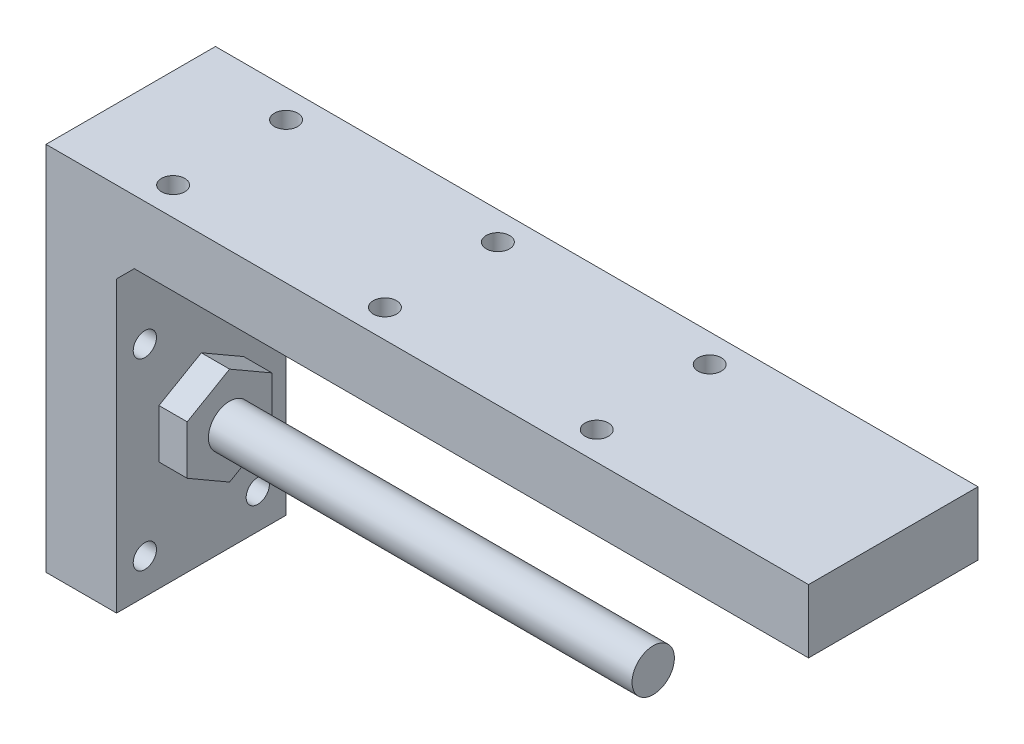
ISO-10303-21;
HEADER;
FILE_DESCRIPTION(('STEP AP214'),'2;1');
FILE_NAME('part.step','',(''),(''),'','','');
FILE_SCHEMA(('AUTOMOTIVE_DESIGN { 1 0 10303 214 1 1 1 1 }'));
ENDSEC;
DATA;
#1=APPLICATION_CONTEXT('core data for automotive mechanical design processes');
#2=APPLICATION_PROTOCOL_DEFINITION('international standard','automotive_design',2000,#1);
#3=PRODUCT_CONTEXT('',#1,'mechanical');
#4=PRODUCT('Part','Part','',(#3));
#5=PRODUCT_RELATED_PRODUCT_CATEGORY('part','',(#4));
#6=PRODUCT_DEFINITION_FORMATION('','',#4);
#7=PRODUCT_DEFINITION_CONTEXT('part definition',#1,'design');
#8=PRODUCT_DEFINITION('design','',#6,#7);
#9=PRODUCT_DEFINITION_SHAPE('','',#8);
#10=(LENGTH_UNIT() NAMED_UNIT(*) SI_UNIT(.MILLI.,.METRE.));
#11=(NAMED_UNIT(*) PLANE_ANGLE_UNIT() SI_UNIT($,.RADIAN.));
#12=(NAMED_UNIT(*) SI_UNIT($,.STERADIAN.) SOLID_ANGLE_UNIT());
#13=UNCERTAINTY_MEASURE_WITH_UNIT(LENGTH_MEASURE(1.E-05),#10,'distance_accuracy_value','');
#14=(GEOMETRIC_REPRESENTATION_CONTEXT(3) GLOBAL_UNCERTAINTY_ASSIGNED_CONTEXT((#13)) GLOBAL_UNIT_ASSIGNED_CONTEXT((#10,
#11,#12)) REPRESENTATION_CONTEXT('',''));
#15=CARTESIAN_POINT('',(0.,0.,0.));
#16=DIRECTION('',(0.,0.,1.));
#17=DIRECTION('',(1.,0.,0.));
#18=AXIS2_PLACEMENT_3D('',#15,#16,#17);
#19=CARTESIAN_POINT('',(9.99999999999999,43.5,24.));
#20=DIRECTION('',(-1.,0.,0.));
#21=DIRECTION('',(0.,-1.,0.));
#22=AXIS2_PLACEMENT_3D('',#19,#20,#21);
#23=PLANE('',#22);
#24=CARTESIAN_POINT('',(10.,31.,4.));
#25=DIRECTION('',(-1.,0.,0.));
#26=DIRECTION('',(0.,-1.,0.));
#27=AXIS2_PLACEMENT_3D('',#24,#25,#26);
#28=CIRCLE('',#27,1.64999999999999);
#29=CARTESIAN_POINT('',(10.,29.35,4.));
#30=VERTEX_POINT('',#29);
#31=EDGE_CURVE('E416',#30,#30,#28,.T.);
#32=ORIENTED_EDGE('',*,*,#31,.T.);
#33=EDGE_LOOP('',(#32));
#34=FACE_BOUND('',#33,.T.);
#35=CARTESIAN_POINT('',(10.,31.,20.));
#36=DIRECTION('',(-1.,0.,0.));
#37=DIRECTION('',(0.,-1.,0.));
#38=AXIS2_PLACEMENT_3D('',#35,#36,#37);
#39=CIRCLE('',#38,1.64999999999999);
#40=CARTESIAN_POINT('',(10.,29.35,20.));
#41=VERTEX_POINT('',#40);
#42=EDGE_CURVE('E408',#41,#41,#39,.T.);
#43=ORIENTED_EDGE('',*,*,#42,.T.);
#44=EDGE_LOOP('',(#43));
#45=FACE_BOUND('',#44,.T.);
#46=CARTESIAN_POINT('',(10.,5.,20.));
#47=DIRECTION('',(-1.,0.,0.));
#48=DIRECTION('',(0.,-1.,0.));
#49=AXIS2_PLACEMENT_3D('',#46,#47,#48);
#50=CIRCLE('',#49,1.64999999999999);
#51=CARTESIAN_POINT('',(10.,3.35000000000001,20.));
#52=VERTEX_POINT('',#51);
#53=EDGE_CURVE('E400',#52,#52,#50,.T.);
#54=ORIENTED_EDGE('',*,*,#53,.T.);
#55=EDGE_LOOP('',(#54));
#56=FACE_BOUND('',#55,.T.);
#57=CARTESIAN_POINT('',(10.,5.,4.));
#58=DIRECTION('',(-1.,0.,0.));
#59=DIRECTION('',(0.,-1.,0.));
#60=AXIS2_PLACEMENT_3D('',#57,#58,#59);
#61=CIRCLE('',#60,1.64999999999999);
#62=CARTESIAN_POINT('',(10.,3.35000000000001,4.));
#63=VERTEX_POINT('',#62);
#64=EDGE_CURVE('E392',#63,#63,#61,.T.);
#65=ORIENTED_EDGE('',*,*,#64,.T.);
#66=EDGE_LOOP('',(#65));
#67=FACE_BOUND('',#66,.T.);
#68=DIRECTION('',(0.,1.,0.));
#69=VECTOR('',#68,1.);
#70=CARTESIAN_POINT('',(9.99999999999999,43.5,0.));
#71=LINE('',#70,#69);
#72=CARTESIAN_POINT('',(10.,0.,0.));
#73=VERTEX_POINT('',#72);
#74=CARTESIAN_POINT('',(9.99999999999999,41.,0.));
#75=VERTEX_POINT('',#74);
#76=EDGE_CURVE('E300',#73,#75,#71,.T.);
#77=ORIENTED_EDGE('',*,*,#76,.T.);
#78=DIRECTION('',(0.,0.,1.));
#79=VECTOR('',#78,1.);
#80=CARTESIAN_POINT('',(9.99999999999999,41.,24.));
#81=LINE('',#80,#79);
#82=CARTESIAN_POINT('',(9.99999999999999,41.,24.));
#83=VERTEX_POINT('',#82);
#84=EDGE_CURVE('E186',#75,#83,#81,.T.);
#85=ORIENTED_EDGE('',*,*,#84,.T.);
#86=DIRECTION('',(0.,1.,0.));
#87=VECTOR('',#86,1.);
#88=CARTESIAN_POINT('',(9.99999999999999,43.5,24.));
#89=LINE('',#88,#87);
#90=CARTESIAN_POINT('',(10.,0.,24.));
#91=VERTEX_POINT('',#90);
#92=EDGE_CURVE('E280',#91,#83,#89,.T.);
#93=ORIENTED_EDGE('',*,*,#92,.F.);
#94=DIRECTION('',(0.,0.,-1.));
#95=VECTOR('',#94,1.);
#96=CARTESIAN_POINT('',(10.,0.,24.));
#97=LINE('',#96,#95);
#98=EDGE_CURVE('E175',#91,#73,#97,.T.);
#99=ORIENTED_EDGE('',*,*,#98,.T.);
#100=EDGE_LOOP('',(#77,#85,#93,#99));
#101=FACE_BOUND('',#100,.T.);
#102=DIRECTION('',(0.,1.,0.));
#103=VECTOR('',#102,1.);
#104=CARTESIAN_POINT('',(10.,15.5358983848622,6.));
#105=LINE('',#104,#103);
#106=CARTESIAN_POINT('',(10.,15.5358983848622,6.));
#107=VERTEX_POINT('',#106);
#108=CARTESIAN_POINT('',(10.,22.4641016151378,6.));
#109=VERTEX_POINT('',#108);
#110=EDGE_CURVE('E229',#107,#109,#105,.T.);
#111=ORIENTED_EDGE('',*,*,#110,.F.);
#112=DIRECTION('',(0.,0.5,-0.866025403784439));
#113=VECTOR('',#112,1.);
#114=CARTESIAN_POINT('',(10.,12.0717967697245,12.));
#115=LINE('',#114,#113);
#116=CARTESIAN_POINT('',(10.,12.0717967697245,12.));
#117=VERTEX_POINT('',#116);
#118=EDGE_CURVE('E213',#117,#107,#115,.T.);
#119=ORIENTED_EDGE('',*,*,#118,.F.);
#120=DIRECTION('',(0.,-0.5,-0.866025403784439));
#121=VECTOR('',#120,1.);
#122=CARTESIAN_POINT('',(10.,15.5358983848622,18.));
#123=LINE('',#122,#121);
#124=CARTESIAN_POINT('',(10.,15.5358983848622,18.));
#125=VERTEX_POINT('',#124);
#126=EDGE_CURVE('E245',#125,#117,#123,.T.);
#127=ORIENTED_EDGE('',*,*,#126,.F.);
#128=DIRECTION('',(0.,-1.,0.));
#129=VECTOR('',#128,1.);
#130=CARTESIAN_POINT('',(10.,22.4641016151378,18.));
#131=LINE('',#130,#129);
#132=CARTESIAN_POINT('',(10.,22.4641016151378,18.));
#133=VERTEX_POINT('',#132);
#134=EDGE_CURVE('E241',#133,#125,#131,.T.);
#135=ORIENTED_EDGE('',*,*,#134,.F.);
#136=DIRECTION('',(0.,-0.5,0.866025403784438));
#137=VECTOR('',#136,1.);
#138=CARTESIAN_POINT('',(10.,25.9282032302755,12.));
#139=LINE('',#138,#137);
#140=CARTESIAN_POINT('',(10.,25.9282032302755,12.));
#141=VERTEX_POINT('',#140);
#142=EDGE_CURVE('E237',#141,#133,#139,.T.);
#143=ORIENTED_EDGE('',*,*,#142,.F.);
#144=DIRECTION('',(0.,0.5,0.866025403784439));
#145=VECTOR('',#144,1.);
#146=CARTESIAN_POINT('',(10.,22.4641016151378,6.));
#147=LINE('',#146,#145);
#148=EDGE_CURVE('E233',#109,#141,#147,.T.);
#149=ORIENTED_EDGE('',*,*,#148,.F.);
#150=EDGE_LOOP('',(#111,#119,#127,#135,#143,#149));
#151=FACE_BOUND('',#150,.T.);
#152=ADVANCED_FACE('F49',(#34,#45,#56,#67,#101,#151),#23,.F.);
#153=CARTESIAN_POINT('',(10.,0.,24.));
#154=DIRECTION('',(0.,1.,0.));
#155=DIRECTION('',(-1.,0.,0.));
#156=AXIS2_PLACEMENT_3D('',#153,#154,#155);
#157=PLANE('',#156);
#158=DIRECTION('',(1.,0.,0.));
#159=VECTOR('',#158,1.);
#160=CARTESIAN_POINT('',(10.,0.,0.));
#161=LINE('',#160,#159);
#162=CARTESIAN_POINT('',(0.,0.,0.));
#163=VERTEX_POINT('',#162);
#164=EDGE_CURVE('E275',#163,#73,#161,.T.);
#165=ORIENTED_EDGE('',*,*,#164,.T.);
#166=ORIENTED_EDGE('',*,*,#98,.F.);
#167=DIRECTION('',(1.,0.,0.));
#168=VECTOR('',#167,1.);
#169=CARTESIAN_POINT('',(10.,0.,24.));
#170=LINE('',#169,#168);
#171=CARTESIAN_POINT('',(0.,0.,24.));
#172=VERTEX_POINT('',#171);
#173=EDGE_CURVE('E276',#172,#91,#170,.T.);
#174=ORIENTED_EDGE('',*,*,#173,.F.);
#175=DIRECTION('',(0.,0.,-1.));
#176=VECTOR('',#175,1.);
#177=CARTESIAN_POINT('',(0.,0.,24.));
#178=LINE('',#177,#176);
#179=EDGE_CURVE('E296',#172,#163,#178,.T.);
#180=ORIENTED_EDGE('',*,*,#179,.T.);
#181=EDGE_LOOP('',(#165,#166,#174,#180));
#182=FACE_BOUND('',#181,.T.);
#183=ADVANCED_FACE('F445',(#182),#157,.F.);
#184=CARTESIAN_POINT('',(108.,43.5,24.));
#185=DIRECTION('',(0.,1.,0.));
#186=DIRECTION('',(-1.,0.,0.));
#187=AXIS2_PLACEMENT_3D('',#184,#185,#186);
#188=PLANE('',#187);
#189=CARTESIAN_POINT('',(44.,43.5,4.));
#190=DIRECTION('',(0.,1.,0.));
#191=DIRECTION('',(-1.,0.,0.));
#192=AXIS2_PLACEMENT_3D('',#189,#190,#191);
#193=CIRCLE('',#192,1.65);
#194=CARTESIAN_POINT('',(42.35,43.5,4.));
#195=VERTEX_POINT('',#194);
#196=EDGE_CURVE('E382',#195,#195,#193,.T.);
#197=ORIENTED_EDGE('',*,*,#196,.T.);
#198=EDGE_LOOP('',(#197));
#199=FACE_BOUND('',#198,.T.);
#200=CARTESIAN_POINT('',(74.,43.5,3.99999999999999));
#201=DIRECTION('',(0.,1.,0.));
#202=DIRECTION('',(-1.,0.,0.));
#203=AXIS2_PLACEMENT_3D('',#200,#201,#202);
#204=CIRCLE('',#203,1.65);
#205=CARTESIAN_POINT('',(72.35,43.5,3.99999999999999));
#206=VERTEX_POINT('',#205);
#207=EDGE_CURVE('E374',#206,#206,#204,.T.);
#208=ORIENTED_EDGE('',*,*,#207,.T.);
#209=EDGE_LOOP('',(#208));
#210=FACE_BOUND('',#209,.T.);
#211=CARTESIAN_POINT('',(74.,43.5,20.));
#212=DIRECTION('',(0.,1.,0.));
#213=DIRECTION('',(-1.,0.,0.));
#214=AXIS2_PLACEMENT_3D('',#211,#212,#213);
#215=CIRCLE('',#214,1.65);
#216=CARTESIAN_POINT('',(72.35,43.5,20.));
#217=VERTEX_POINT('',#216);
#218=EDGE_CURVE('E366',#217,#217,#215,.T.);
#219=ORIENTED_EDGE('',*,*,#218,.T.);
#220=EDGE_LOOP('',(#219));
#221=FACE_BOUND('',#220,.T.);
#222=CARTESIAN_POINT('',(44.,43.5,20.));
#223=DIRECTION('',(0.,1.,0.));
#224=DIRECTION('',(-1.,0.,0.));
#225=AXIS2_PLACEMENT_3D('',#222,#223,#224);
#226=CIRCLE('',#225,1.65);
#227=CARTESIAN_POINT('',(42.35,43.5,20.));
#228=VERTEX_POINT('',#227);
#229=EDGE_CURVE('E356',#228,#228,#226,.T.);
#230=ORIENTED_EDGE('',*,*,#229,.T.);
#231=EDGE_LOOP('',(#230));
#232=FACE_BOUND('',#231,.T.);
#233=DIRECTION('',(0.,0.,-1.));
#234=VECTOR('',#233,1.);
#235=CARTESIAN_POINT('',(12.5,43.5,0.));
#236=LINE('',#235,#234);
#237=CARTESIAN_POINT('',(12.5,43.5,19.3126136457566));
#238=VERTEX_POINT('',#237);
#239=CARTESIAN_POINT('',(12.5,43.5,4.68738635424337));
#240=VERTEX_POINT('',#239);
#241=EDGE_CURVE('E167',#238,#240,#236,.T.);
#242=ORIENTED_EDGE('',*,*,#241,.T.);
#243=CARTESIAN_POINT('',(14.,43.5,4.));
#244=DIRECTION('',(0.,1.,0.));
#245=DIRECTION('',(-1.,0.,0.));
#246=AXIS2_PLACEMENT_3D('',#243,#244,#245);
#247=CIRCLE('',#246,1.65);
#248=CARTESIAN_POINT('',(12.5,43.5,3.31261364575663));
#249=VERTEX_POINT('',#248);
#250=EDGE_CURVE('E65',#240,#249,#247,.T.);
#251=ORIENTED_EDGE('',*,*,#250,.T.);
#252=CARTESIAN_POINT('',(12.5,43.5,0.));
#253=VERTEX_POINT('',#252);
#254=EDGE_CURVE('E165',#249,#253,#236,.T.);
#255=ORIENTED_EDGE('',*,*,#254,.T.);
#256=DIRECTION('',(1.,0.,0.));
#257=VECTOR('',#256,1.);
#258=CARTESIAN_POINT('',(108.,43.5,0.));
#259=LINE('',#258,#257);
#260=CARTESIAN_POINT('',(108.,43.5,0.));
#261=VERTEX_POINT('',#260);
#262=EDGE_CURVE('E303',#253,#261,#259,.T.);
#263=ORIENTED_EDGE('',*,*,#262,.T.);
#264=DIRECTION('',(0.,0.,-1.));
#265=VECTOR('',#264,1.);
#266=CARTESIAN_POINT('',(108.,43.5,24.));
#267=LINE('',#266,#265);
#268=CARTESIAN_POINT('',(108.,43.5,24.));
#269=VERTEX_POINT('',#268);
#270=EDGE_CURVE('E181',#269,#261,#267,.T.);
#271=ORIENTED_EDGE('',*,*,#270,.F.);
#272=DIRECTION('',(1.,0.,0.));
#273=VECTOR('',#272,1.);
#274=CARTESIAN_POINT('',(108.,43.5,24.));
#275=LINE('',#274,#273);
#276=CARTESIAN_POINT('',(12.5,43.5,24.));
#277=VERTEX_POINT('',#276);
#278=EDGE_CURVE('E284',#277,#269,#275,.T.);
#279=ORIENTED_EDGE('',*,*,#278,.F.);
#280=CARTESIAN_POINT('',(12.5,43.5,20.6873863542434));
#281=VERTEX_POINT('',#280);
#282=EDGE_CURVE('E177',#277,#281,#236,.T.);
#283=ORIENTED_EDGE('',*,*,#282,.T.);
#284=CARTESIAN_POINT('',(14.,43.5,20.));
#285=DIRECTION('',(0.,1.,0.));
#286=DIRECTION('',(-1.,0.,0.));
#287=AXIS2_PLACEMENT_3D('',#284,#285,#286);
#288=CIRCLE('',#287,1.65);
#289=EDGE_CURVE('E72',#281,#238,#288,.T.);
#290=ORIENTED_EDGE('',*,*,#289,.T.);
#291=EDGE_LOOP('',(#242,#251,#255,#263,#271,#279,#283,#290));
#292=FACE_BOUND('',#291,.T.);
#293=ADVANCED_FACE('F164',(#199,#210,#221,#232,#292),#188,.F.);
#294=CARTESIAN_POINT('',(108.,52.5,24.));
#295=DIRECTION('',(-1.,0.,0.));
#296=DIRECTION('',(0.,-1.,0.));
#297=AXIS2_PLACEMENT_3D('',#294,#295,#296);
#298=PLANE('',#297);
#299=DIRECTION('',(0.,1.,0.));
#300=VECTOR('',#299,1.);
#301=CARTESIAN_POINT('',(108.,52.5,0.));
#302=LINE('',#301,#300);
#303=CARTESIAN_POINT('',(108.,52.5,0.));
#304=VERTEX_POINT('',#303);
#305=EDGE_CURVE('E306',#261,#304,#302,.T.);
#306=ORIENTED_EDGE('',*,*,#305,.T.);
#307=DIRECTION('',(0.,0.,-1.));
#308=VECTOR('',#307,1.);
#309=CARTESIAN_POINT('',(108.,52.5,24.));
#310=LINE('',#309,#308);
#311=CARTESIAN_POINT('',(108.,52.5,24.));
#312=VERTEX_POINT('',#311);
#313=EDGE_CURVE('E321',#312,#304,#310,.T.);
#314=ORIENTED_EDGE('',*,*,#313,.F.);
#315=DIRECTION('',(0.,1.,0.));
#316=VECTOR('',#315,1.);
#317=CARTESIAN_POINT('',(108.,52.5,24.));
#318=LINE('',#317,#316);
#319=EDGE_CURVE('E287',#269,#312,#318,.T.);
#320=ORIENTED_EDGE('',*,*,#319,.F.);
#321=ORIENTED_EDGE('',*,*,#270,.T.);
#322=EDGE_LOOP('',(#306,#314,#320,#321));
#323=FACE_BOUND('',#322,.T.);
#324=ADVANCED_FACE('F331',(#323),#298,.F.);
#325=CARTESIAN_POINT('',(0.,52.5,24.));
#326=DIRECTION('',(0.,-1.,0.));
#327=DIRECTION('',(0.,0.,-1.));
#328=AXIS2_PLACEMENT_3D('',#325,#326,#327);
#329=PLANE('',#328);
#330=CARTESIAN_POINT('',(14.,52.5,4.));
#331=DIRECTION('',(0.,1.,0.));
#332=DIRECTION('',(0.,0.,1.));
#333=AXIS2_PLACEMENT_3D('',#330,#331,#332);
#334=CIRCLE('',#333,1.65);
#335=CARTESIAN_POINT('',(14.,52.5,5.65));
#336=VERTEX_POINT('',#335);
#337=EDGE_CURVE('E161',#336,#336,#334,.T.);
#338=ORIENTED_EDGE('',*,*,#337,.F.);
#339=EDGE_LOOP('',(#338));
#340=FACE_BOUND('',#339,.T.);
#341=CARTESIAN_POINT('',(44.,52.5,4.));
#342=DIRECTION('',(0.,1.,0.));
#343=DIRECTION('',(0.,0.,1.));
#344=AXIS2_PLACEMENT_3D('',#341,#342,#343);
#345=CIRCLE('',#344,1.65);
#346=CARTESIAN_POINT('',(44.,52.5,5.64999999999999));
#347=VERTEX_POINT('',#346);
#348=EDGE_CURVE('E169',#347,#347,#345,.T.);
#349=ORIENTED_EDGE('',*,*,#348,.F.);
#350=EDGE_LOOP('',(#349));
#351=FACE_BOUND('',#350,.T.);
#352=CARTESIAN_POINT('',(74.,52.5,3.99999999999999));
#353=DIRECTION('',(0.,1.,0.));
#354=DIRECTION('',(0.,0.,1.));
#355=AXIS2_PLACEMENT_3D('',#352,#353,#354);
#356=CIRCLE('',#355,1.65);
#357=CARTESIAN_POINT('',(74.,52.5,5.64999999999999));
#358=VERTEX_POINT('',#357);
#359=EDGE_CURVE('E378',#358,#358,#356,.T.);
#360=ORIENTED_EDGE('',*,*,#359,.F.);
#361=EDGE_LOOP('',(#360));
#362=FACE_BOUND('',#361,.T.);
#363=CARTESIAN_POINT('',(74.,52.5,20.));
#364=DIRECTION('',(0.,1.,0.));
#365=DIRECTION('',(0.,0.,1.));
#366=AXIS2_PLACEMENT_3D('',#363,#364,#365);
#367=CIRCLE('',#366,1.65);
#368=CARTESIAN_POINT('',(74.,52.5,21.65));
#369=VERTEX_POINT('',#368);
#370=EDGE_CURVE('E370',#369,#369,#367,.T.);
#371=ORIENTED_EDGE('',*,*,#370,.F.);
#372=EDGE_LOOP('',(#371));
#373=FACE_BOUND('',#372,.T.);
#374=CARTESIAN_POINT('',(44.,52.5,20.));
#375=DIRECTION('',(0.,1.,0.));
#376=DIRECTION('',(0.,0.,1.));
#377=AXIS2_PLACEMENT_3D('',#374,#375,#376);
#378=CIRCLE('',#377,1.65);
#379=CARTESIAN_POINT('',(44.,52.5,21.65));
#380=VERTEX_POINT('',#379);
#381=EDGE_CURVE('E362',#380,#380,#378,.T.);
#382=ORIENTED_EDGE('',*,*,#381,.F.);
#383=EDGE_LOOP('',(#382));
#384=FACE_BOUND('',#383,.T.);
#385=CARTESIAN_POINT('',(14.,52.5,20.));
#386=DIRECTION('',(0.,1.,0.));
#387=DIRECTION('',(0.,0.,1.));
#388=AXIS2_PLACEMENT_3D('',#385,#386,#387);
#389=CIRCLE('',#388,1.65);
#390=CARTESIAN_POINT('',(14.,52.5,21.65));
#391=VERTEX_POINT('',#390);
#392=EDGE_CURVE('E351',#391,#391,#389,.T.);
#393=ORIENTED_EDGE('',*,*,#392,.F.);
#394=EDGE_LOOP('',(#393));
#395=FACE_BOUND('',#394,.T.);
#396=DIRECTION('',(-1.,0.,0.));
#397=VECTOR('',#396,1.);
#398=CARTESIAN_POINT('',(0.,52.5,0.));
#399=LINE('',#398,#397);
#400=CARTESIAN_POINT('',(0.,52.5,0.));
#401=VERTEX_POINT('',#400);
#402=EDGE_CURVE('E309',#304,#401,#399,.T.);
#403=ORIENTED_EDGE('',*,*,#402,.T.);
#404=DIRECTION('',(0.,0.,-1.));
#405=VECTOR('',#404,1.);
#406=CARTESIAN_POINT('',(0.,52.5,24.));
#407=LINE('',#406,#405);
#408=CARTESIAN_POINT('',(0.,52.5,24.));
#409=VERTEX_POINT('',#408);
#410=EDGE_CURVE('E317',#409,#401,#407,.T.);
#411=ORIENTED_EDGE('',*,*,#410,.F.);
#412=DIRECTION('',(-1.,0.,0.));
#413=VECTOR('',#412,1.);
#414=CARTESIAN_POINT('',(0.,52.5,24.));
#415=LINE('',#414,#413);
#416=EDGE_CURVE('E290',#312,#409,#415,.T.);
#417=ORIENTED_EDGE('',*,*,#416,.F.);
#418=ORIENTED_EDGE('',*,*,#313,.T.);
#419=EDGE_LOOP('',(#403,#411,#417,#418));
#420=FACE_BOUND('',#419,.T.);
#421=ADVANCED_FACE('F340',(#340,#351,#362,#373,#384,#395,#420),#329,.F.);
#422=CARTESIAN_POINT('',(0.,0.,24.));
#423=DIRECTION('',(1.,0.,0.));
#424=DIRECTION('',(0.,0.,-1.));
#425=AXIS2_PLACEMENT_3D('',#422,#423,#424);
#426=PLANE('',#425);
#427=CARTESIAN_POINT('',(0.,31.,4.));
#428=DIRECTION('',(-1.,0.,0.));
#429=DIRECTION('',(0.,0.,1.));
#430=AXIS2_PLACEMENT_3D('',#427,#428,#429);
#431=CIRCLE('',#430,1.64999999999999);
#432=CARTESIAN_POINT('',(0.,31.,5.64999999999999));
#433=VERTEX_POINT('',#432);
#434=EDGE_CURVE('E420',#433,#433,#431,.T.);
#435=ORIENTED_EDGE('',*,*,#434,.F.);
#436=EDGE_LOOP('',(#435));
#437=FACE_BOUND('',#436,.T.);
#438=CARTESIAN_POINT('',(0.,31.,20.));
#439=DIRECTION('',(-1.,0.,0.));
#440=DIRECTION('',(0.,0.,1.));
#441=AXIS2_PLACEMENT_3D('',#438,#439,#440);
#442=CIRCLE('',#441,1.64999999999999);
#443=CARTESIAN_POINT('',(0.,31.,21.65));
#444=VERTEX_POINT('',#443);
#445=EDGE_CURVE('E412',#444,#444,#442,.T.);
#446=ORIENTED_EDGE('',*,*,#445,.F.);
#447=EDGE_LOOP('',(#446));
#448=FACE_BOUND('',#447,.T.);
#449=CARTESIAN_POINT('',(0.,5.,20.));
#450=DIRECTION('',(-1.,0.,0.));
#451=DIRECTION('',(0.,0.,1.));
#452=AXIS2_PLACEMENT_3D('',#449,#450,#451);
#453=CIRCLE('',#452,1.64999999999999);
#454=CARTESIAN_POINT('',(0.,5.,21.65));
#455=VERTEX_POINT('',#454);
#456=EDGE_CURVE('E404',#455,#455,#453,.T.);
#457=ORIENTED_EDGE('',*,*,#456,.F.);
#458=EDGE_LOOP('',(#457));
#459=FACE_BOUND('',#458,.T.);
#460=CARTESIAN_POINT('',(0.,5.,4.));
#461=DIRECTION('',(-1.,0.,0.));
#462=DIRECTION('',(0.,0.,1.));
#463=AXIS2_PLACEMENT_3D('',#460,#461,#462);
#464=CIRCLE('',#463,1.64999999999999);
#465=CARTESIAN_POINT('',(0.,5.,5.64999999999999));
#466=VERTEX_POINT('',#465);
#467=EDGE_CURVE('E396',#466,#466,#464,.T.);
#468=ORIENTED_EDGE('',*,*,#467,.F.);
#469=EDGE_LOOP('',(#468));
#470=FACE_BOUND('',#469,.T.);
#471=DIRECTION('',(0.,-1.,0.));
#472=VECTOR('',#471,1.);
#473=CARTESIAN_POINT('',(0.,0.,0.));
#474=LINE('',#473,#472);
#475=EDGE_CURVE('E281',#401,#163,#474,.T.);
#476=ORIENTED_EDGE('',*,*,#475,.T.);
#477=ORIENTED_EDGE('',*,*,#179,.F.);
#478=DIRECTION('',(0.,-1.,0.));
#479=VECTOR('',#478,1.);
#480=CARTESIAN_POINT('',(0.,0.,24.));
#481=LINE('',#480,#479);
#482=EDGE_CURVE('E293',#409,#172,#481,.T.);
#483=ORIENTED_EDGE('',*,*,#482,.F.);
#484=ORIENTED_EDGE('',*,*,#410,.T.);
#485=EDGE_LOOP('',(#476,#477,#483,#484));
#486=FACE_BOUND('',#485,.T.);
#487=ADVANCED_FACE('F344',(#437,#448,#459,#470,#486),#426,.F.);
#488=CARTESIAN_POINT('',(0.,0.,24.));
#489=DIRECTION('',(0.,0.,-1.));
#490=DIRECTION('',(-1.,0.,0.));
#491=AXIS2_PLACEMENT_3D('',#488,#489,#490);
#492=PLANE('',#491);
#493=ORIENTED_EDGE('',*,*,#173,.T.);
#494=ORIENTED_EDGE('',*,*,#92,.T.);
#495=DIRECTION('',(-0.707106781186549,-0.707106781186546,0.));
#496=VECTOR('',#495,1.);
#497=CARTESIAN_POINT('',(-15.5,15.5000000000001,24.));
#498=LINE('',#497,#496);
#499=EDGE_CURVE('E194',#83,#277,#498,.F.);
#500=ORIENTED_EDGE('',*,*,#499,.T.);
#501=ORIENTED_EDGE('',*,*,#278,.T.);
#502=ORIENTED_EDGE('',*,*,#319,.T.);
#503=ORIENTED_EDGE('',*,*,#416,.T.);
#504=ORIENTED_EDGE('',*,*,#482,.T.);
#505=EDGE_LOOP('',(#493,#494,#500,#501,#502,#503,#504));
#506=FACE_BOUND('',#505,.T.);
#507=ADVANCED_FACE('F347',(#506),#492,.F.);
#508=CARTESIAN_POINT('',(0.,0.,0.));
#509=DIRECTION('',(0.,0.,-1.));
#510=DIRECTION('',(-1.,0.,0.));
#511=AXIS2_PLACEMENT_3D('',#508,#509,#510);
#512=PLANE('',#511);
#513=ORIENTED_EDGE('',*,*,#164,.F.);
#514=ORIENTED_EDGE('',*,*,#475,.F.);
#515=ORIENTED_EDGE('',*,*,#402,.F.);
#516=ORIENTED_EDGE('',*,*,#305,.F.);
#517=ORIENTED_EDGE('',*,*,#262,.F.);
#518=DIRECTION('',(0.707106781186549,0.707106781186546,0.));
#519=VECTOR('',#518,1.);
#520=CARTESIAN_POINT('',(12.5,43.5,0.));
#521=LINE('',#520,#519);
#522=EDGE_CURVE('E172',#253,#75,#521,.F.);
#523=ORIENTED_EDGE('',*,*,#522,.T.);
#524=ORIENTED_EDGE('',*,*,#76,.F.);
#525=EDGE_LOOP('',(#513,#514,#515,#516,#517,#523,#524));
#526=FACE_BOUND('',#525,.T.);
#527=ADVANCED_FACE('F336',(#526),#512,.T.);
#528=CARTESIAN_POINT('',(12.5,43.5,24.));
#529=DIRECTION('',(0.707106781186546,-0.707106781186549,0.));
#530=DIRECTION('',(0.,0.,1.));
#531=AXIS2_PLACEMENT_3D('',#528,#529,#530);
#532=PLANE('',#531);
#533=ORIENTED_EDGE('',*,*,#254,.F.);
#534=CARTESIAN_POINT('',(14.,45.,4.));
#535=DIRECTION('',(0.707106781186546,-0.707106781186549,0.));
#536=DIRECTION('',(0.707106781186549,0.707106781186546,0.));
#537=AXIS2_PLACEMENT_3D('',#534,#535,#536);
#538=ELLIPSE('',#537,2.3334523779156,1.65);
#539=EDGE_CURVE('E154',#249,#240,#538,.F.);
#540=ORIENTED_EDGE('',*,*,#539,.T.);
#541=ORIENTED_EDGE('',*,*,#241,.F.);
#542=CARTESIAN_POINT('',(14.,45.,20.));
#543=DIRECTION('',(0.707106781186546,-0.707106781186549,0.));
#544=DIRECTION('',(0.707106781186549,0.707106781186546,0.));
#545=AXIS2_PLACEMENT_3D('',#542,#543,#544);
#546=ELLIPSE('',#545,2.3334523779156,1.65);
#547=EDGE_CURVE('E11',#238,#281,#546,.F.);
#548=ORIENTED_EDGE('',*,*,#547,.T.);
#549=ORIENTED_EDGE('',*,*,#282,.F.);
#550=ORIENTED_EDGE('',*,*,#499,.F.);
#551=ORIENTED_EDGE('',*,*,#84,.F.);
#552=ORIENTED_EDGE('',*,*,#522,.F.);
#553=EDGE_LOOP('',(#533,#540,#541,#548,#549,#550,#551,#552));
#554=FACE_BOUND('',#553,.T.);
#555=ADVANCED_FACE('F52',(#554),#532,.T.);
#556=CARTESIAN_POINT('',(14.,15.5358983848622,6.));
#557=DIRECTION('',(0.,0.,1.));
#558=DIRECTION('',(1.,0.,0.));
#559=AXIS2_PLACEMENT_3D('',#556,#557,#558);
#560=PLANE('',#559);
#561=ORIENTED_EDGE('',*,*,#110,.T.);
#562=DIRECTION('',(-1.,0.,0.));
#563=VECTOR('',#562,1.);
#564=CARTESIAN_POINT('',(14.,22.4641016151378,6.));
#565=LINE('',#564,#563);
#566=CARTESIAN_POINT('',(14.,22.4641016151378,6.));
#567=VERTEX_POINT('',#566);
#568=EDGE_CURVE('E271',#567,#109,#565,.T.);
#569=ORIENTED_EDGE('',*,*,#568,.F.);
#570=DIRECTION('',(0.,1.,0.));
#571=VECTOR('',#570,1.);
#572=CARTESIAN_POINT('',(14.,15.5358983848622,6.));
#573=LINE('',#572,#571);
#574=CARTESIAN_POINT('',(14.,15.5358983848622,6.));
#575=VERTEX_POINT('',#574);
#576=EDGE_CURVE('E208',#575,#567,#573,.T.);
#577=ORIENTED_EDGE('',*,*,#576,.F.);
#578=DIRECTION('',(-1.,0.,0.));
#579=VECTOR('',#578,1.);
#580=CARTESIAN_POINT('',(14.,15.5358983848622,6.));
#581=LINE('',#580,#579);
#582=EDGE_CURVE('E228',#575,#107,#581,.T.);
#583=ORIENTED_EDGE('',*,*,#582,.T.);
#584=EDGE_LOOP('',(#561,#569,#577,#583));
#585=FACE_BOUND('',#584,.T.);
#586=ADVANCED_FACE('F457',(#585),#560,.F.);
#587=CARTESIAN_POINT('',(14.,22.4641016151378,6.));
#588=DIRECTION('',(0.,-0.866025403784439,0.5));
#589=DIRECTION('',(0.,-0.5,-0.866025403784439));
#590=AXIS2_PLACEMENT_3D('',#587,#588,#589);
#591=PLANE('',#590);
#592=ORIENTED_EDGE('',*,*,#148,.T.);
#593=DIRECTION('',(-1.,0.,0.));
#594=VECTOR('',#593,1.);
#595=CARTESIAN_POINT('',(14.,25.9282032302755,12.));
#596=LINE('',#595,#594);
#597=CARTESIAN_POINT('',(14.,25.9282032302755,12.));
#598=VERTEX_POINT('',#597);
#599=EDGE_CURVE('E267',#598,#141,#596,.T.);
#600=ORIENTED_EDGE('',*,*,#599,.F.);
#601=DIRECTION('',(0.,0.5,0.866025403784439));
#602=VECTOR('',#601,1.);
#603=CARTESIAN_POINT('',(14.,22.4641016151378,6.));
#604=LINE('',#603,#602);
#605=EDGE_CURVE('E212',#567,#598,#604,.T.);
#606=ORIENTED_EDGE('',*,*,#605,.F.);
#607=ORIENTED_EDGE('',*,*,#568,.T.);
#608=EDGE_LOOP('',(#592,#600,#606,#607));
#609=FACE_BOUND('',#608,.T.);
#610=ADVANCED_FACE('F473',(#609),#591,.F.);
#611=CARTESIAN_POINT('',(14.,25.9282032302755,12.));
#612=DIRECTION('',(0.,-0.866025403784439,-0.5));
#613=DIRECTION('',(0.,0.5,-0.866025403784438));
#614=AXIS2_PLACEMENT_3D('',#611,#612,#613);
#615=PLANE('',#614);
#616=ORIENTED_EDGE('',*,*,#142,.T.);
#617=DIRECTION('',(-1.,0.,0.));
#618=VECTOR('',#617,1.);
#619=CARTESIAN_POINT('',(14.,22.4641016151378,18.));
#620=LINE('',#619,#618);
#621=CARTESIAN_POINT('',(14.,22.4641016151378,18.));
#622=VERTEX_POINT('',#621);
#623=EDGE_CURVE('E263',#622,#133,#620,.T.);
#624=ORIENTED_EDGE('',*,*,#623,.F.);
#625=DIRECTION('',(0.,-0.5,0.866025403784438));
#626=VECTOR('',#625,1.);
#627=CARTESIAN_POINT('',(14.,25.9282032302755,12.));
#628=LINE('',#627,#626);
#629=EDGE_CURVE('E216',#598,#622,#628,.T.);
#630=ORIENTED_EDGE('',*,*,#629,.F.);
#631=ORIENTED_EDGE('',*,*,#599,.T.);
#632=EDGE_LOOP('',(#616,#624,#630,#631));
#633=FACE_BOUND('',#632,.T.);
#634=ADVANCED_FACE('F471',(#633),#615,.F.);
#635=CARTESIAN_POINT('',(14.,22.4641016151378,18.));
#636=DIRECTION('',(0.,0.,-1.));
#637=DIRECTION('',(-1.,0.,0.));
#638=AXIS2_PLACEMENT_3D('',#635,#636,#637);
#639=PLANE('',#638);
#640=ORIENTED_EDGE('',*,*,#134,.T.);
#641=DIRECTION('',(-1.,0.,0.));
#642=VECTOR('',#641,1.);
#643=CARTESIAN_POINT('',(14.,15.5358983848622,18.));
#644=LINE('',#643,#642);
#645=CARTESIAN_POINT('',(14.,15.5358983848622,18.));
#646=VERTEX_POINT('',#645);
#647=EDGE_CURVE('E259',#646,#125,#644,.T.);
#648=ORIENTED_EDGE('',*,*,#647,.F.);
#649=DIRECTION('',(0.,-1.,0.));
#650=VECTOR('',#649,1.);
#651=CARTESIAN_POINT('',(14.,22.4641016151378,18.));
#652=LINE('',#651,#650);
#653=EDGE_CURVE('E219',#622,#646,#652,.T.);
#654=ORIENTED_EDGE('',*,*,#653,.F.);
#655=ORIENTED_EDGE('',*,*,#623,.T.);
#656=EDGE_LOOP('',(#640,#648,#654,#655));
#657=FACE_BOUND('',#656,.T.);
#658=ADVANCED_FACE('F467',(#657),#639,.F.);
#659=CARTESIAN_POINT('',(14.,15.5358983848622,18.));
#660=DIRECTION('',(0.,0.866025403784439,-0.5));
#661=DIRECTION('',(0.,0.5,0.866025403784439));
#662=AXIS2_PLACEMENT_3D('',#659,#660,#661);
#663=PLANE('',#662);
#664=ORIENTED_EDGE('',*,*,#126,.T.);
#665=DIRECTION('',(-1.,0.,0.));
#666=VECTOR('',#665,1.);
#667=CARTESIAN_POINT('',(14.,12.0717967697245,12.));
#668=LINE('',#667,#666);
#669=CARTESIAN_POINT('',(14.,12.0717967697245,12.));
#670=VERTEX_POINT('',#669);
#671=EDGE_CURVE('E255',#670,#117,#668,.T.);
#672=ORIENTED_EDGE('',*,*,#671,.F.);
#673=DIRECTION('',(0.,-0.5,-0.866025403784439));
#674=VECTOR('',#673,1.);
#675=CARTESIAN_POINT('',(14.,15.5358983848622,18.));
#676=LINE('',#675,#674);
#677=EDGE_CURVE('E222',#646,#670,#676,.T.);
#678=ORIENTED_EDGE('',*,*,#677,.F.);
#679=ORIENTED_EDGE('',*,*,#647,.T.);
#680=EDGE_LOOP('',(#664,#672,#678,#679));
#681=FACE_BOUND('',#680,.T.);
#682=ADVANCED_FACE('F465',(#681),#663,.F.);
#683=CARTESIAN_POINT('',(14.,12.0717967697245,12.));
#684=DIRECTION('',(0.,0.866025403784439,0.5));
#685=DIRECTION('',(0.,-0.5,0.866025403784439));
#686=AXIS2_PLACEMENT_3D('',#683,#684,#685);
#687=PLANE('',#686);
#688=ORIENTED_EDGE('',*,*,#118,.T.);
#689=ORIENTED_EDGE('',*,*,#582,.F.);
#690=DIRECTION('',(0.,0.5,-0.866025403784439));
#691=VECTOR('',#690,1.);
#692=CARTESIAN_POINT('',(14.,12.0717967697245,12.));
#693=LINE('',#692,#691);
#694=EDGE_CURVE('E225',#670,#575,#693,.T.);
#695=ORIENTED_EDGE('',*,*,#694,.F.);
#696=ORIENTED_EDGE('',*,*,#671,.T.);
#697=EDGE_LOOP('',(#688,#689,#695,#696));
#698=FACE_BOUND('',#697,.T.);
#699=ADVANCED_FACE('F453',(#698),#687,.F.);
#700=CARTESIAN_POINT('',(14.,0.,0.));
#701=DIRECTION('',(1.,0.,0.));
#702=DIRECTION('',(0.,1.,0.));
#703=AXIS2_PLACEMENT_3D('',#700,#701,#702);
#704=PLANE('',#703);
#705=CARTESIAN_POINT('',(14.,19.,12.));
#706=DIRECTION('',(1.,0.,0.));
#707=DIRECTION('',(0.,1.,0.));
#708=AXIS2_PLACEMENT_3D('',#705,#706,#707);
#709=CIRCLE('',#708,3.);
#710=CARTESIAN_POINT('',(14.,22.,12.));
#711=VERTEX_POINT('',#710);
#712=EDGE_CURVE('E59',#711,#711,#709,.T.);
#713=ORIENTED_EDGE('',*,*,#712,.F.);
#714=EDGE_LOOP('',(#713));
#715=FACE_BOUND('',#714,.T.);
#716=ORIENTED_EDGE('',*,*,#576,.T.);
#717=ORIENTED_EDGE('',*,*,#605,.T.);
#718=ORIENTED_EDGE('',*,*,#629,.T.);
#719=ORIENTED_EDGE('',*,*,#653,.T.);
#720=ORIENTED_EDGE('',*,*,#677,.T.);
#721=ORIENTED_EDGE('',*,*,#694,.T.);
#722=EDGE_LOOP('',(#716,#717,#718,#719,#720,#721));
#723=FACE_BOUND('',#722,.T.);
#724=ADVANCED_FACE('F459',(#715,#723),#704,.T.);
#725=CARTESIAN_POINT('',(74.,19.,12.));
#726=DIRECTION('',(-1.,0.,0.));
#727=DIRECTION('',(0.,-1.,0.));
#728=AXIS2_PLACEMENT_3D('',#725,#726,#727);
#729=CYLINDRICAL_SURFACE('',#728,3.);
#730=CARTESIAN_POINT('',(74.,19.,12.));
#731=DIRECTION('',(1.,0.,0.));
#732=DIRECTION('',(0.,1.,0.));
#733=AXIS2_PLACEMENT_3D('',#730,#731,#732);
#734=CIRCLE('',#733,3.);
#735=CARTESIAN_POINT('',(74.,22.,12.));
#736=VERTEX_POINT('',#735);
#737=EDGE_CURVE('E206',#736,#736,#734,.T.);
#738=ORIENTED_EDGE('',*,*,#737,.F.);
#739=EDGE_LOOP('',(#738));
#740=FACE_BOUND('',#739,.T.);
#741=ORIENTED_EDGE('',*,*,#712,.T.);
#742=EDGE_LOOP('',(#741));
#743=FACE_BOUND('',#742,.T.);
#744=ADVANCED_FACE('F586',(#740,#743),#729,.T.);
#745=CARTESIAN_POINT('',(74.,19.,12.));
#746=DIRECTION('',(1.,0.,0.));
#747=DIRECTION('',(0.,1.,0.));
#748=AXIS2_PLACEMENT_3D('',#745,#746,#747);
#749=PLANE('',#748);
#750=ORIENTED_EDGE('',*,*,#737,.T.);
#751=EDGE_LOOP('',(#750));
#752=FACE_BOUND('',#751,.T.);
#753=ADVANCED_FACE('F596',(#752),#749,.T.);
#754=CARTESIAN_POINT('',(14.,52.5,20.));
#755=DIRECTION('',(0.,1.,0.));
#756=DIRECTION('',(0.,0.,1.));
#757=AXIS2_PLACEMENT_3D('',#754,#755,#756);
#758=CYLINDRICAL_SURFACE('',#757,1.65);
#759=ORIENTED_EDGE('',*,*,#392,.T.);
#760=EDGE_LOOP('',(#759));
#761=FACE_BOUND('',#760,.T.);
#762=ORIENTED_EDGE('',*,*,#547,.F.);
#763=ORIENTED_EDGE('',*,*,#289,.F.);
#764=EDGE_LOOP('',(#762,#763));
#765=FACE_BOUND('',#764,.T.);
#766=ADVANCED_FACE('F349',(#761,#765),#758,.F.);
#767=CARTESIAN_POINT('',(44.,52.5,20.));
#768=DIRECTION('',(0.,1.,0.));
#769=DIRECTION('',(0.,0.,1.));
#770=AXIS2_PLACEMENT_3D('',#767,#768,#769);
#771=CYLINDRICAL_SURFACE('',#770,1.65);
#772=ORIENTED_EDGE('',*,*,#381,.T.);
#773=EDGE_LOOP('',(#772));
#774=FACE_BOUND('',#773,.T.);
#775=ORIENTED_EDGE('',*,*,#229,.F.);
#776=EDGE_LOOP('',(#775));
#777=FACE_BOUND('',#776,.T.);
#778=ADVANCED_FACE('F617',(#774,#777),#771,.F.);
#779=CARTESIAN_POINT('',(74.,52.5,20.));
#780=DIRECTION('',(0.,1.,0.));
#781=DIRECTION('',(0.,0.,1.));
#782=AXIS2_PLACEMENT_3D('',#779,#780,#781);
#783=CYLINDRICAL_SURFACE('',#782,1.65);
#784=ORIENTED_EDGE('',*,*,#370,.T.);
#785=EDGE_LOOP('',(#784));
#786=FACE_BOUND('',#785,.T.);
#787=ORIENTED_EDGE('',*,*,#218,.F.);
#788=EDGE_LOOP('',(#787));
#789=FACE_BOUND('',#788,.T.);
#790=ADVANCED_FACE('F625',(#786,#789),#783,.F.);
#791=CARTESIAN_POINT('',(74.,52.5,3.99999999999999));
#792=DIRECTION('',(0.,1.,0.));
#793=DIRECTION('',(0.,0.,1.));
#794=AXIS2_PLACEMENT_3D('',#791,#792,#793);
#795=CYLINDRICAL_SURFACE('',#794,1.65);
#796=ORIENTED_EDGE('',*,*,#359,.T.);
#797=EDGE_LOOP('',(#796));
#798=FACE_BOUND('',#797,.T.);
#799=ORIENTED_EDGE('',*,*,#207,.F.);
#800=EDGE_LOOP('',(#799));
#801=FACE_BOUND('',#800,.T.);
#802=ADVANCED_FACE('F633',(#798,#801),#795,.F.);
#803=CARTESIAN_POINT('',(44.,52.5,4.));
#804=DIRECTION('',(0.,1.,0.));
#805=DIRECTION('',(0.,0.,1.));
#806=AXIS2_PLACEMENT_3D('',#803,#804,#805);
#807=CYLINDRICAL_SURFACE('',#806,1.65);
#808=ORIENTED_EDGE('',*,*,#348,.T.);
#809=EDGE_LOOP('',(#808));
#810=FACE_BOUND('',#809,.T.);
#811=ORIENTED_EDGE('',*,*,#196,.F.);
#812=EDGE_LOOP('',(#811));
#813=FACE_BOUND('',#812,.T.);
#814=ADVANCED_FACE('F641',(#810,#813),#807,.F.);
#815=CARTESIAN_POINT('',(14.,52.5,4.));
#816=DIRECTION('',(0.,1.,0.));
#817=DIRECTION('',(0.,0.,1.));
#818=AXIS2_PLACEMENT_3D('',#815,#816,#817);
#819=CYLINDRICAL_SURFACE('',#818,1.65);
#820=ORIENTED_EDGE('',*,*,#337,.T.);
#821=EDGE_LOOP('',(#820));
#822=FACE_BOUND('',#821,.T.);
#823=ORIENTED_EDGE('',*,*,#539,.F.);
#824=ORIENTED_EDGE('',*,*,#250,.F.);
#825=EDGE_LOOP('',(#823,#824));
#826=FACE_BOUND('',#825,.T.);
#827=ADVANCED_FACE('F155',(#822,#826),#819,.F.);
#828=CARTESIAN_POINT('',(0.,5.,4.));
#829=DIRECTION('',(-1.,0.,0.));
#830=DIRECTION('',(0.,0.,1.));
#831=AXIS2_PLACEMENT_3D('',#828,#829,#830);
#832=CYLINDRICAL_SURFACE('',#831,1.64999999999999);
#833=ORIENTED_EDGE('',*,*,#467,.T.);
#834=EDGE_LOOP('',(#833));
#835=FACE_BOUND('',#834,.T.);
#836=ORIENTED_EDGE('',*,*,#64,.F.);
#837=EDGE_LOOP('',(#836));
#838=FACE_BOUND('',#837,.T.);
#839=ADVANCED_FACE('F437',(#835,#838),#832,.F.);
#840=CARTESIAN_POINT('',(0.,5.,20.));
#841=DIRECTION('',(-1.,0.,0.));
#842=DIRECTION('',(0.,0.,1.));
#843=AXIS2_PLACEMENT_3D('',#840,#841,#842);
#844=CYLINDRICAL_SURFACE('',#843,1.64999999999999);
#845=ORIENTED_EDGE('',*,*,#456,.T.);
#846=EDGE_LOOP('',(#845));
#847=FACE_BOUND('',#846,.T.);
#848=ORIENTED_EDGE('',*,*,#53,.F.);
#849=EDGE_LOOP('',(#848));
#850=FACE_BOUND('',#849,.T.);
#851=ADVANCED_FACE('F440',(#847,#850),#844,.F.);
#852=CARTESIAN_POINT('',(0.,31.,20.));
#853=DIRECTION('',(-1.,0.,0.));
#854=DIRECTION('',(0.,0.,1.));
#855=AXIS2_PLACEMENT_3D('',#852,#853,#854);
#856=CYLINDRICAL_SURFACE('',#855,1.64999999999999);
#857=ORIENTED_EDGE('',*,*,#445,.T.);
#858=EDGE_LOOP('',(#857));
#859=FACE_BOUND('',#858,.T.);
#860=ORIENTED_EDGE('',*,*,#42,.F.);
#861=EDGE_LOOP('',(#860));
#862=FACE_BOUND('',#861,.T.);
#863=ADVANCED_FACE('F667',(#859,#862),#856,.F.);
#864=CARTESIAN_POINT('',(0.,31.,4.));
#865=DIRECTION('',(-1.,0.,0.));
#866=DIRECTION('',(0.,0.,1.));
#867=AXIS2_PLACEMENT_3D('',#864,#865,#866);
#868=CYLINDRICAL_SURFACE('',#867,1.64999999999999);
#869=ORIENTED_EDGE('',*,*,#434,.T.);
#870=EDGE_LOOP('',(#869));
#871=FACE_BOUND('',#870,.T.);
#872=ORIENTED_EDGE('',*,*,#31,.F.);
#873=EDGE_LOOP('',(#872));
#874=FACE_BOUND('',#873,.T.);
#875=ADVANCED_FACE('F425',(#871,#874),#868,.F.);
#876=CLOSED_SHELL('',(#152,#183,#293,#324,#421,#487,#507,#527,#555,#586,#610,#634,#658,#682,
#699,#724,#744,#753,#766,#778,#790,#802,#814,#827,#839,#851,#863,#875));
#877=MANIFOLD_SOLID_BREP('B2',#876);
#878=ADVANCED_BREP_SHAPE_REPRESENTATION('',(#18,#877),#14);
#879=SHAPE_DEFINITION_REPRESENTATION(#9,#878);
ENDSEC;
END-ISO-10303-21;
